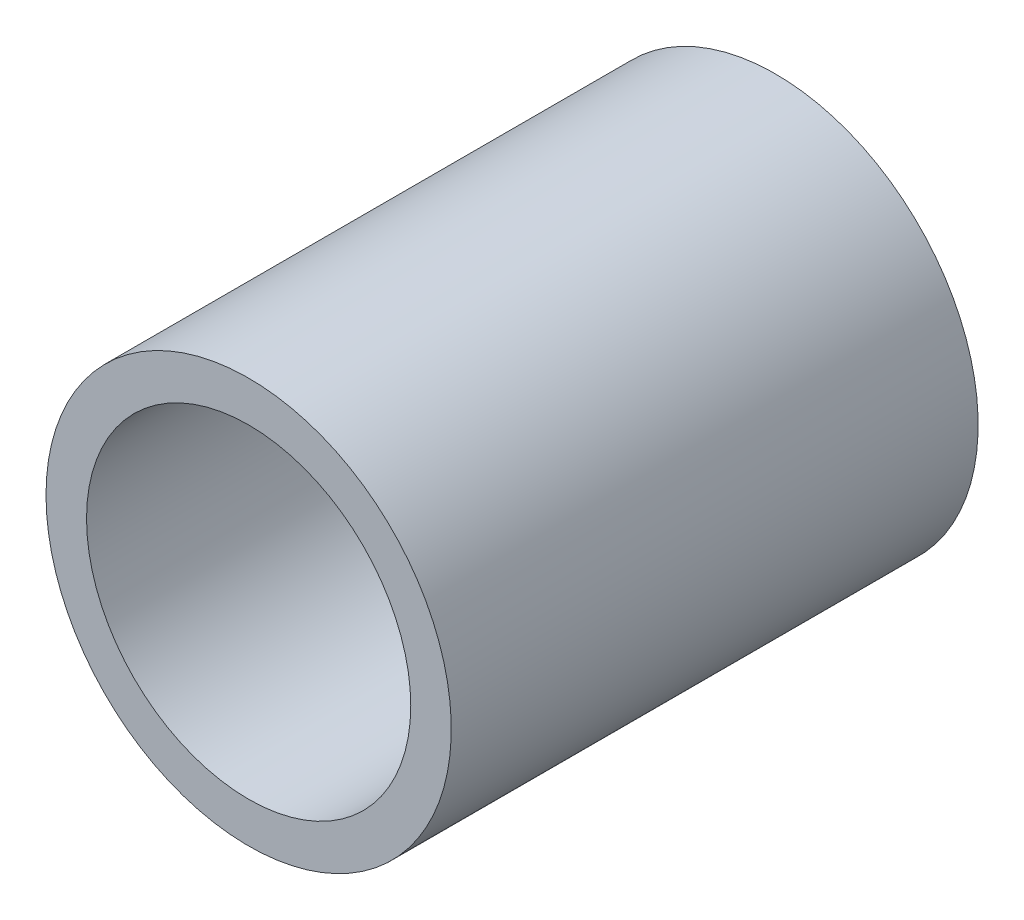
ISO-10303-21;
HEADER;
FILE_DESCRIPTION(('STEP AP214'),'2;1');
FILE_NAME('part.step','',(''),(''),'','','');
FILE_SCHEMA(('AUTOMOTIVE_DESIGN { 1 0 10303 214 1 1 1 1 }'));
ENDSEC;
DATA;
#1=APPLICATION_CONTEXT('core data for automotive mechanical design processes');
#2=APPLICATION_PROTOCOL_DEFINITION('international standard','automotive_design',2000,#1);
#3=PRODUCT_CONTEXT('',#1,'mechanical');
#4=PRODUCT('Part','Part','',(#3));
#5=PRODUCT_RELATED_PRODUCT_CATEGORY('part','',(#4));
#6=PRODUCT_DEFINITION_FORMATION('','',#4);
#7=PRODUCT_DEFINITION_CONTEXT('part definition',#1,'design');
#8=PRODUCT_DEFINITION('design','',#6,#7);
#9=PRODUCT_DEFINITION_SHAPE('','',#8);
#10=(LENGTH_UNIT() NAMED_UNIT(*) SI_UNIT(.MILLI.,.METRE.));
#11=(NAMED_UNIT(*) PLANE_ANGLE_UNIT() SI_UNIT($,.RADIAN.));
#12=(NAMED_UNIT(*) SI_UNIT($,.STERADIAN.) SOLID_ANGLE_UNIT());
#13=UNCERTAINTY_MEASURE_WITH_UNIT(LENGTH_MEASURE(1.E-05),#10,'distance_accuracy_value','');
#14=(GEOMETRIC_REPRESENTATION_CONTEXT(3) GLOBAL_UNCERTAINTY_ASSIGNED_CONTEXT((#13)) GLOBAL_UNIT_ASSIGNED_CONTEXT((#10,
#11,#12)) REPRESENTATION_CONTEXT('',''));
#15=CARTESIAN_POINT('',(0.,0.,0.));
#16=DIRECTION('',(0.,0.,1.));
#17=DIRECTION('',(1.,0.,0.));
#18=AXIS2_PLACEMENT_3D('',#15,#16,#17);
#19=CARTESIAN_POINT('',(0.,0.,13.));
#20=DIRECTION('',(0.,0.,-1.));
#21=DIRECTION('',(-1.,0.,0.));
#22=AXIS2_PLACEMENT_3D('',#19,#20,#21);
#23=CYLINDRICAL_SURFACE('',#22,5.);
#24=CARTESIAN_POINT('',(0.,0.,13.));
#25=DIRECTION('',(0.,0.,1.));
#26=DIRECTION('',(1.,0.,0.));
#27=AXIS2_PLACEMENT_3D('',#24,#25,#26);
#28=CIRCLE('',#27,5.);
#29=CARTESIAN_POINT('',(-5.,0.,13.));
#30=VERTEX_POINT('',#29);
#31=EDGE_CURVE('E10',#30,#30,#28,.T.);
#32=CARTESIAN_POINT('',(0.,0.,0.));
#33=DIRECTION('',(0.,0.,1.));
#34=DIRECTION('',(1.,0.,0.));
#35=AXIS2_PLACEMENT_3D('',#32,#33,#34);
#36=CIRCLE('',#35,5.);
#37=CARTESIAN_POINT('',(-5.,0.,0.));
#38=VERTEX_POINT('',#37);
#39=EDGE_CURVE('E40',#38,#38,#36,.T.);
#40=CARTESIAN_POINT('',(-5.,0.,13.));
#41=CARTESIAN_POINT('',(-5.,0.,12.8645833333333));
#42=CARTESIAN_POINT('',(-5.,0.,12.7291666666667));
#43=CARTESIAN_POINT('',(-5.,0.,12.4583333333333));
#44=CARTESIAN_POINT('',(-5.,0.,12.3229166666667));
#45=CARTESIAN_POINT('',(-5.,0.,12.0520833333333));
#46=CARTESIAN_POINT('',(-5.,0.,11.9166666666667));
#47=CARTESIAN_POINT('',(-5.,0.,11.6458333333333));
#48=CARTESIAN_POINT('',(-5.,0.,11.5104166666667));
#49=CARTESIAN_POINT('',(-5.,0.,11.2395833333333));
#50=CARTESIAN_POINT('',(-5.,0.,11.1041666666667));
#51=CARTESIAN_POINT('',(-5.,0.,10.8333333333333));
#52=CARTESIAN_POINT('',(-5.,0.,10.6979166666667));
#53=CARTESIAN_POINT('',(-5.,0.,10.4270833333333));
#54=CARTESIAN_POINT('',(-5.,0.,10.2916666666667));
#55=CARTESIAN_POINT('',(-5.,0.,10.0208333333333));
#56=CARTESIAN_POINT('',(-5.,0.,9.88541666666667));
#57=CARTESIAN_POINT('',(-5.,0.,9.61458333333333));
#58=CARTESIAN_POINT('',(-5.,0.,9.47916666666667));
#59=CARTESIAN_POINT('',(-5.,0.,9.20833333333333));
#60=CARTESIAN_POINT('',(-5.,0.,9.07291666666667));
#61=CARTESIAN_POINT('',(-5.,0.,8.80208333333333));
#62=CARTESIAN_POINT('',(-5.,0.,8.66666666666667));
#63=CARTESIAN_POINT('',(-5.,0.,8.39583333333333));
#64=CARTESIAN_POINT('',(-5.,0.,8.26041666666667));
#65=CARTESIAN_POINT('',(-5.,0.,7.98958333333333));
#66=CARTESIAN_POINT('',(-5.,0.,7.85416666666667));
#67=CARTESIAN_POINT('',(-5.,0.,7.58333333333333));
#68=CARTESIAN_POINT('',(-5.,0.,7.44791666666667));
#69=CARTESIAN_POINT('',(-5.,0.,7.17708333333333));
#70=CARTESIAN_POINT('',(-5.,0.,7.04166666666667));
#71=CARTESIAN_POINT('',(-5.,0.,6.77083333333333));
#72=CARTESIAN_POINT('',(-5.,0.,6.63541666666667));
#73=CARTESIAN_POINT('',(-5.,0.,6.36458333333333));
#74=CARTESIAN_POINT('',(-5.,0.,6.22916666666667));
#75=CARTESIAN_POINT('',(-5.,0.,5.95833333333333));
#76=CARTESIAN_POINT('',(-5.,0.,5.82291666666667));
#77=CARTESIAN_POINT('',(-5.,0.,5.55208333333333));
#78=CARTESIAN_POINT('',(-5.,0.,5.41666666666667));
#79=CARTESIAN_POINT('',(-5.,0.,5.14583333333333));
#80=CARTESIAN_POINT('',(-5.,0.,5.01041666666667));
#81=CARTESIAN_POINT('',(-5.,0.,4.73958333333333));
#82=CARTESIAN_POINT('',(-5.,0.,4.60416666666667));
#83=CARTESIAN_POINT('',(-5.,0.,4.33333333333333));
#84=CARTESIAN_POINT('',(-5.,0.,4.19791666666667));
#85=CARTESIAN_POINT('',(-5.,0.,3.92708333333333));
#86=CARTESIAN_POINT('',(-5.,0.,3.79166666666667));
#87=CARTESIAN_POINT('',(-5.,0.,3.52083333333333));
#88=CARTESIAN_POINT('',(-5.,0.,3.38541666666667));
#89=CARTESIAN_POINT('',(-5.,0.,3.11458333333333));
#90=CARTESIAN_POINT('',(-5.,0.,2.97916666666667));
#91=CARTESIAN_POINT('',(-5.,0.,2.70833333333333));
#92=CARTESIAN_POINT('',(-5.,0.,2.57291666666667));
#93=CARTESIAN_POINT('',(-5.,0.,2.30208333333333));
#94=CARTESIAN_POINT('',(-5.,0.,2.16666666666667));
#95=CARTESIAN_POINT('',(-5.,0.,1.89583333333333));
#96=CARTESIAN_POINT('',(-5.,0.,1.76041666666667));
#97=CARTESIAN_POINT('',(-5.,0.,1.48958333333333));
#98=CARTESIAN_POINT('',(-5.,0.,1.35416666666667));
#99=CARTESIAN_POINT('',(-5.,0.,1.08333333333333));
#100=CARTESIAN_POINT('',(-5.,0.,0.947916666666667));
#101=CARTESIAN_POINT('',(-5.,0.,0.677083333333334));
#102=CARTESIAN_POINT('',(-5.,0.,0.541666666666667));
#103=CARTESIAN_POINT('',(-5.,0.,0.270833333333334));
#104=CARTESIAN_POINT('',(-5.,0.,0.135416666666667));
#105=CARTESIAN_POINT('',(-5.,0.,0.));
#106=B_SPLINE_CURVE_WITH_KNOTS('',3,(#40,#41,#42,#43,#44,#45,#46,#47,#48,#49,#50,#51,#52,#53,
#54,#55,#56,#57,#58,#59,#60,#61,#62,#63,#64,#65,#66,#67,#68,#69,#70,#71,#72,#73,#74,#75,#76,#77,
#78,#79,#80,#81,#82,#83,#84,#85,#86,#87,#88,#89,#90,#91,#92,#93,#94,#95,#96,#97,#98,#99,#100,
#101,#102,#103,#104,#105),.UNSPECIFIED.,.F.,.F.,(4,2,2,2,2,2,2,2,2,2,2,2,2,2,2,2,2,2,2,2,2,2,2,
2,2,2,2,2,2,2,2,2,4),(0.,0.406249999999999,0.812499999999999,1.21875,1.625,2.03125,2.4375,
2.84375,3.25,3.65625,4.0625,4.46875,4.875,5.28125,5.6875,6.09375,6.5,6.90625,7.3125,7.71875,
8.125,8.53125,8.9375,9.34375,9.75,10.15625,10.5625,10.96875,11.375,11.78125,12.1875,12.59375,
13.),.UNSPECIFIED.);
#107=EDGE_CURVE('BSEAM37',#30,#38,#106,.T.);
#108=ORIENTED_EDGE('',*,*,#31,.F.);
#109=ORIENTED_EDGE('',*,*,#39,.T.);
#110=ORIENTED_EDGE('',*,*,#107,.T.);
#111=ORIENTED_EDGE('',*,*,#107,.F.);
#112=EDGE_LOOP('',(#108,#110,#109,#111));
#113=FACE_BOUND('',#112,.T.);
#114=ADVANCED_FACE('F37',(#113),#23,.T.);
#115=CARTESIAN_POINT('',(0.,0.,13.));
#116=DIRECTION('',(0.,0.,1.));
#117=DIRECTION('',(1.,0.,0.));
#118=AXIS2_PLACEMENT_3D('',#115,#116,#117);
#119=PLANE('',#118);
#120=CARTESIAN_POINT('',(0.,0.,13.));
#121=DIRECTION('',(0.,0.,1.));
#122=DIRECTION('',(1.,0.,0.));
#123=AXIS2_PLACEMENT_3D('',#120,#121,#122);
#124=CIRCLE('',#123,4.);
#125=CARTESIAN_POINT('',(-4.,0.,13.));
#126=VERTEX_POINT('',#125);
#127=EDGE_CURVE('E47',#126,#126,#124,.T.);
#128=ORIENTED_EDGE('',*,*,#127,.F.);
#129=EDGE_LOOP('',(#128));
#130=FACE_BOUND('',#129,.T.);
#131=ORIENTED_EDGE('',*,*,#31,.T.);
#132=EDGE_LOOP('',(#131));
#133=FACE_BOUND('',#132,.T.);
#134=ADVANCED_FACE('F58',(#130,#133),#119,.T.);
#135=CARTESIAN_POINT('',(0.,0.,0.));
#136=DIRECTION('',(0.,0.,1.));
#137=DIRECTION('',(1.,0.,0.));
#138=AXIS2_PLACEMENT_3D('',#135,#136,#137);
#139=PLANE('',#138);
#140=CARTESIAN_POINT('',(0.,0.,0.));
#141=DIRECTION('',(0.,0.,1.));
#142=DIRECTION('',(1.,0.,0.));
#143=AXIS2_PLACEMENT_3D('',#140,#141,#142);
#144=CIRCLE('',#143,4.);
#145=CARTESIAN_POINT('',(-4.,0.,0.));
#146=VERTEX_POINT('',#145);
#147=EDGE_CURVE('E49',#146,#146,#144,.T.);
#148=ORIENTED_EDGE('',*,*,#147,.T.);
#149=EDGE_LOOP('',(#148));
#150=FACE_BOUND('',#149,.T.);
#151=ORIENTED_EDGE('',*,*,#39,.F.);
#152=EDGE_LOOP('',(#151));
#153=FACE_BOUND('',#152,.T.);
#154=ADVANCED_FACE('F60',(#150,#153),#139,.F.);
#155=CARTESIAN_POINT('',(0.,0.,13.));
#156=DIRECTION('',(0.,0.,-1.));
#157=DIRECTION('',(-1.,0.,0.));
#158=AXIS2_PLACEMENT_3D('',#155,#156,#157);
#159=CYLINDRICAL_SURFACE('',#158,4.);
#160=CARTESIAN_POINT('',(-4.,0.,13.));
#161=CARTESIAN_POINT('',(-4.,0.,12.8645833333333));
#162=CARTESIAN_POINT('',(-4.,0.,12.7291666666667));
#163=CARTESIAN_POINT('',(-4.,0.,12.4583333333333));
#164=CARTESIAN_POINT('',(-4.,0.,12.3229166666667));
#165=CARTESIAN_POINT('',(-4.,0.,12.0520833333333));
#166=CARTESIAN_POINT('',(-4.,0.,11.9166666666667));
#167=CARTESIAN_POINT('',(-4.,0.,11.6458333333333));
#168=CARTESIAN_POINT('',(-4.,0.,11.5104166666667));
#169=CARTESIAN_POINT('',(-4.,0.,11.2395833333333));
#170=CARTESIAN_POINT('',(-4.,0.,11.1041666666667));
#171=CARTESIAN_POINT('',(-4.,0.,10.8333333333333));
#172=CARTESIAN_POINT('',(-4.,0.,10.6979166666667));
#173=CARTESIAN_POINT('',(-4.,0.,10.4270833333333));
#174=CARTESIAN_POINT('',(-4.,0.,10.2916666666667));
#175=CARTESIAN_POINT('',(-4.,0.,10.0208333333333));
#176=CARTESIAN_POINT('',(-4.,0.,9.88541666666667));
#177=CARTESIAN_POINT('',(-4.,0.,9.61458333333333));
#178=CARTESIAN_POINT('',(-4.,0.,9.47916666666667));
#179=CARTESIAN_POINT('',(-4.,0.,9.20833333333333));
#180=CARTESIAN_POINT('',(-4.,0.,9.07291666666667));
#181=CARTESIAN_POINT('',(-4.,0.,8.80208333333333));
#182=CARTESIAN_POINT('',(-4.,0.,8.66666666666667));
#183=CARTESIAN_POINT('',(-4.,0.,8.39583333333333));
#184=CARTESIAN_POINT('',(-4.,0.,8.26041666666667));
#185=CARTESIAN_POINT('',(-4.,0.,7.98958333333333));
#186=CARTESIAN_POINT('',(-4.,0.,7.85416666666667));
#187=CARTESIAN_POINT('',(-4.,0.,7.58333333333333));
#188=CARTESIAN_POINT('',(-4.,0.,7.44791666666667));
#189=CARTESIAN_POINT('',(-4.,0.,7.17708333333333));
#190=CARTESIAN_POINT('',(-4.,0.,7.04166666666667));
#191=CARTESIAN_POINT('',(-4.,0.,6.77083333333333));
#192=CARTESIAN_POINT('',(-4.,0.,6.63541666666667));
#193=CARTESIAN_POINT('',(-4.,0.,6.36458333333333));
#194=CARTESIAN_POINT('',(-4.,0.,6.22916666666667));
#195=CARTESIAN_POINT('',(-4.,0.,5.95833333333333));
#196=CARTESIAN_POINT('',(-4.,0.,5.82291666666667));
#197=CARTESIAN_POINT('',(-4.,0.,5.55208333333333));
#198=CARTESIAN_POINT('',(-4.,0.,5.41666666666667));
#199=CARTESIAN_POINT('',(-4.,0.,5.14583333333333));
#200=CARTESIAN_POINT('',(-4.,0.,5.01041666666667));
#201=CARTESIAN_POINT('',(-4.,0.,4.73958333333333));
#202=CARTESIAN_POINT('',(-4.,0.,4.60416666666667));
#203=CARTESIAN_POINT('',(-4.,0.,4.33333333333333));
#204=CARTESIAN_POINT('',(-4.,0.,4.19791666666667));
#205=CARTESIAN_POINT('',(-4.,0.,3.92708333333333));
#206=CARTESIAN_POINT('',(-4.,0.,3.79166666666667));
#207=CARTESIAN_POINT('',(-4.,0.,3.52083333333333));
#208=CARTESIAN_POINT('',(-4.,0.,3.38541666666667));
#209=CARTESIAN_POINT('',(-4.,0.,3.11458333333333));
#210=CARTESIAN_POINT('',(-4.,0.,2.97916666666667));
#211=CARTESIAN_POINT('',(-4.,0.,2.70833333333333));
#212=CARTESIAN_POINT('',(-4.,0.,2.57291666666667));
#213=CARTESIAN_POINT('',(-4.,0.,2.30208333333333));
#214=CARTESIAN_POINT('',(-4.,0.,2.16666666666667));
#215=CARTESIAN_POINT('',(-4.,0.,1.89583333333333));
#216=CARTESIAN_POINT('',(-4.,0.,1.76041666666667));
#217=CARTESIAN_POINT('',(-4.,0.,1.48958333333333));
#218=CARTESIAN_POINT('',(-4.,0.,1.35416666666667));
#219=CARTESIAN_POINT('',(-4.,0.,1.08333333333333));
#220=CARTESIAN_POINT('',(-4.,0.,0.947916666666667));
#221=CARTESIAN_POINT('',(-4.,0.,0.677083333333334));
#222=CARTESIAN_POINT('',(-4.,0.,0.541666666666667));
#223=CARTESIAN_POINT('',(-4.,0.,0.270833333333334));
#224=CARTESIAN_POINT('',(-4.,0.,0.135416666666667));
#225=CARTESIAN_POINT('',(-4.,0.,0.));
#226=B_SPLINE_CURVE_WITH_KNOTS('',3,(#160,#161,#162,#163,#164,#165,#166,#167,#168,#169,#170,
#171,#172,#173,#174,#175,#176,#177,#178,#179,#180,#181,#182,#183,#184,#185,#186,#187,#188,#189,
#190,#191,#192,#193,#194,#195,#196,#197,#198,#199,#200,#201,#202,#203,#204,#205,#206,#207,#208,
#209,#210,#211,#212,#213,#214,#215,#216,#217,#218,#219,#220,#221,#222,#223,#224,#225),
.UNSPECIFIED.,.F.,.F.,(4,2,2,2,2,2,2,2,2,2,2,2,2,2,2,2,2,2,2,2,2,2,2,2,2,2,2,2,2,2,2,2,4),(0.,
0.406249999999999,0.812499999999999,1.21875,1.625,2.03125,2.4375,2.84375,3.25,3.65625,4.0625,
4.46875,4.875,5.28125,5.6875,6.09375,6.5,6.90625,7.3125,7.71875,8.125,8.53125,8.9375,9.34375,
9.75,10.15625,10.5625,10.96875,11.375,11.78125,12.1875,12.59375,13.),.UNSPECIFIED.);
#227=EDGE_CURVE('BSEAM55',#126,#146,#226,.T.);
#228=ORIENTED_EDGE('',*,*,#127,.T.);
#229=ORIENTED_EDGE('',*,*,#147,.F.);
#230=ORIENTED_EDGE('',*,*,#227,.T.);
#231=ORIENTED_EDGE('',*,*,#227,.F.);
#232=EDGE_LOOP('',(#228,#230,#229,#231));
#233=FACE_BOUND('',#232,.T.);
#234=ADVANCED_FACE('F55',(#233),#159,.F.);
#235=CLOSED_SHELL('',(#114,#134,#154,#234));
#236=MANIFOLD_SOLID_BREP('B2',#235);
#237=ADVANCED_BREP_SHAPE_REPRESENTATION('',(#18,#236),#14);
#238=SHAPE_DEFINITION_REPRESENTATION(#9,#237);
ENDSEC;
END-ISO-10303-21;
